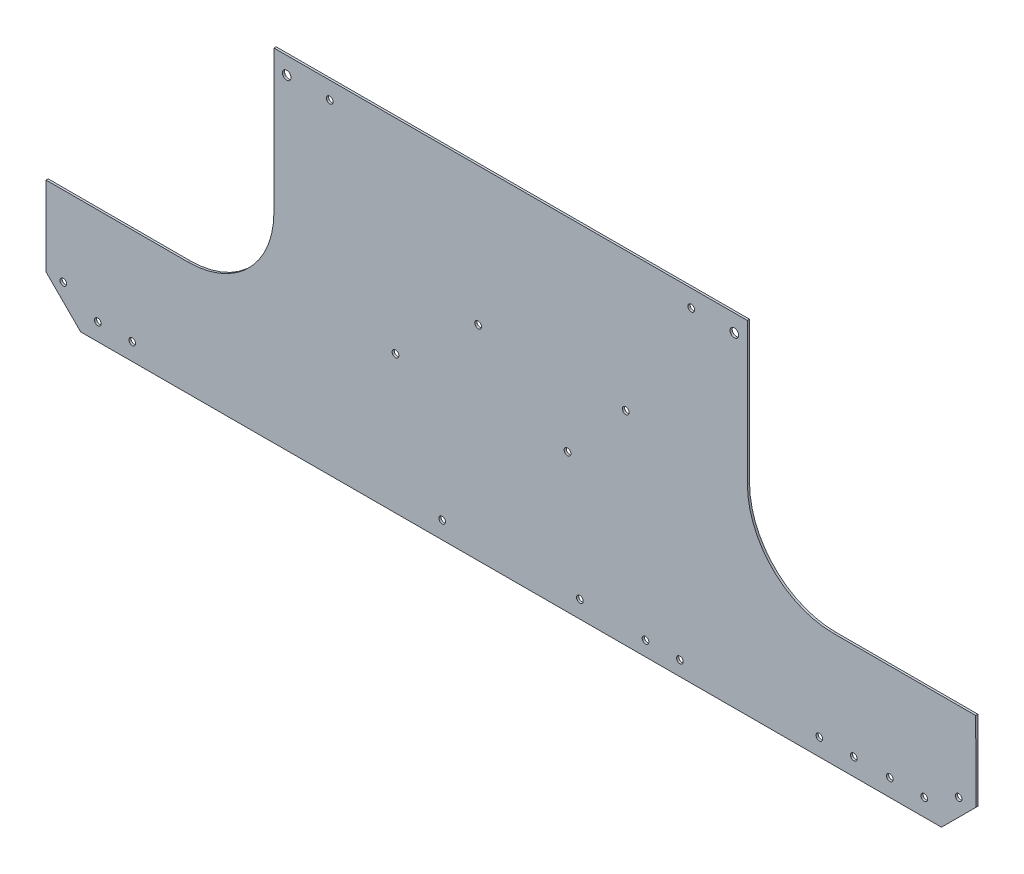
ISO-10303-21;
HEADER;
FILE_DESCRIPTION(('STEP AP214'),'2;1');
FILE_NAME('part.step','',(''),(''),'','','');
FILE_SCHEMA(('AUTOMOTIVE_DESIGN { 1 0 10303 214 1 1 1 1 }'));
ENDSEC;
DATA;
#1=APPLICATION_CONTEXT('core data for automotive mechanical design processes');
#2=APPLICATION_PROTOCOL_DEFINITION('international standard','automotive_design',2000,#1);
#3=PRODUCT_CONTEXT('',#1,'mechanical');
#4=PRODUCT('Part','Part','',(#3));
#5=PRODUCT_RELATED_PRODUCT_CATEGORY('part','',(#4));
#6=PRODUCT_DEFINITION_FORMATION('','',#4);
#7=PRODUCT_DEFINITION_CONTEXT('part definition',#1,'design');
#8=PRODUCT_DEFINITION('design','',#6,#7);
#9=PRODUCT_DEFINITION_SHAPE('','',#8);
#10=(LENGTH_UNIT() NAMED_UNIT(*) SI_UNIT(.MILLI.,.METRE.));
#11=(NAMED_UNIT(*) PLANE_ANGLE_UNIT() SI_UNIT($,.RADIAN.));
#12=(NAMED_UNIT(*) SI_UNIT($,.STERADIAN.) SOLID_ANGLE_UNIT());
#13=UNCERTAINTY_MEASURE_WITH_UNIT(LENGTH_MEASURE(1.E-05),#10,'distance_accuracy_value','');
#14=(GEOMETRIC_REPRESENTATION_CONTEXT(3) GLOBAL_UNCERTAINTY_ASSIGNED_CONTEXT((#13)) GLOBAL_UNIT_ASSIGNED_CONTEXT((#10,
#11,#12)) REPRESENTATION_CONTEXT('',''));
#15=CARTESIAN_POINT('',(0.,0.,0.));
#16=DIRECTION('',(0.,0.,1.));
#17=DIRECTION('',(1.,0.,0.));
#18=AXIS2_PLACEMENT_3D('',#15,#16,#17);
#19=CARTESIAN_POINT('',(0.,0.,0.79375));
#20=DIRECTION('',(0.,0.,1.));
#21=DIRECTION('',(1.,0.,0.));
#22=AXIS2_PLACEMENT_3D('',#19,#20,#21);
#23=PLANE('',#22);
#24=CARTESIAN_POINT('',(19.9172047054702,-149.007237749099,0.793749999999999));
#25=DIRECTION('',(0.,0.,-1.));
#26=DIRECTION('',(-1.,0.,0.));
#27=AXIS2_PLACEMENT_3D('',#24,#25,#26);
#28=CIRCLE('',#27,2.48919999999999);
#29=CARTESIAN_POINT('',(17.4280047054702,-149.007237749099,0.793749999999999));
#30=VERTEX_POINT('',#29);
#31=EDGE_CURVE('E734',#30,#30,#28,.T.);
#32=ORIENTED_EDGE('',*,*,#31,.T.);
#33=EDGE_LOOP('',(#32));
#34=FACE_BOUND('',#33,.T.);
#35=CARTESIAN_POINT('',(-46.0271854160732,-100.817324835213,0.793749999999999));
#36=DIRECTION('',(0.,0.,-1.));
#37=DIRECTION('',(-1.,0.,0.));
#38=AXIS2_PLACEMENT_3D('',#35,#36,#37);
#39=CIRCLE('',#38,2.4892);
#40=CARTESIAN_POINT('',(-48.5163854160732,-100.817324835213,0.793749999999999));
#41=VERTEX_POINT('',#40);
#42=EDGE_CURVE('E739',#41,#41,#39,.T.);
#43=ORIENTED_EDGE('',*,*,#42,.T.);
#44=EDGE_LOOP('',(#43));
#45=FACE_BOUND('',#44,.T.);
#46=CARTESIAN_POINT('',(111.223655321268,-11.4749169265356,0.793750000000001));
#47=DIRECTION('',(0.,0.,1.));
#48=DIRECTION('',(1.,0.,0.));
#49=AXIS2_PLACEMENT_3D('',#46,#47,#48);
#50=CIRCLE('',#49,2.45744999999999);
#51=CARTESIAN_POINT('',(113.681105321268,-11.4749169265356,0.793750000000001));
#52=VERTEX_POINT('',#51);
#53=EDGE_CURVE('E246',#52,#52,#50,.T.);
#54=ORIENTED_EDGE('',*,*,#53,.F.);
#55=EDGE_LOOP('',(#54));
#56=FACE_BOUND('',#55,.T.);
#57=CARTESIAN_POINT('',(-155.475985843315,-11.9127224193871,0.793750000000001));
#58=DIRECTION('',(0.,0.,1.));
#59=DIRECTION('',(1.,0.,0.));
#60=AXIS2_PLACEMENT_3D('',#57,#58,#59);
#61=CIRCLE('',#60,2.45745);
#62=CARTESIAN_POINT('',(-153.018535843315,-11.9127224193871,0.793750000000001));
#63=VERTEX_POINT('',#62);
#64=EDGE_CURVE('E240',#63,#63,#61,.T.);
#65=ORIENTED_EDGE('',*,*,#64,.F.);
#66=EDGE_LOOP('',(#65));
#67=FACE_BOUND('',#66,.T.);
#68=CARTESIAN_POINT('',(308.425197087397,-225.463986018174,0.793750000000001));
#69=DIRECTION('',(0.,0.,1.));
#70=DIRECTION('',(1.,0.,0.));
#71=AXIS2_PLACEMENT_3D('',#68,#69,#70);
#72=CIRCLE('',#71,2.45744999999997);
#73=CARTESIAN_POINT('',(310.882647087397,-225.463986018174,0.793750000000001));
#74=VERTEX_POINT('',#73);
#75=EDGE_CURVE('E234',#74,#74,#72,.T.);
#76=ORIENTED_EDGE('',*,*,#75,.F.);
#77=EDGE_LOOP('',(#76));
#78=FACE_BOUND('',#77,.T.);
#79=CARTESIAN_POINT('',(283.046079192675,-238.205664670761,0.793750000000001));
#80=DIRECTION('',(0.,0.,1.));
#81=DIRECTION('',(1.,0.,0.));
#82=AXIS2_PLACEMENT_3D('',#79,#80,#81);
#83=CIRCLE('',#82,2.45744999999997);
#84=CARTESIAN_POINT('',(285.503529192675,-238.205664670761,0.793750000000001));
#85=VERTEX_POINT('',#84);
#86=EDGE_CURVE('E228',#85,#85,#83,.T.);
#87=ORIENTED_EDGE('',*,*,#86,.F.);
#88=EDGE_LOOP('',(#87));
#89=FACE_BOUND('',#88,.T.);
#90=CARTESIAN_POINT('',(257.646113415862,-238.247360434943,0.793750000000001));
#91=DIRECTION('',(0.,0.,1.));
#92=DIRECTION('',(1.,0.,0.));
#93=AXIS2_PLACEMENT_3D('',#90,#91,#92);
#94=CIRCLE('',#93,2.45744999999997);
#95=CARTESIAN_POINT('',(260.103563415862,-238.247360434943,0.793750000000001));
#96=VERTEX_POINT('',#95);
#97=EDGE_CURVE('E222',#96,#96,#94,.T.);
#98=ORIENTED_EDGE('',*,*,#97,.F.);
#99=EDGE_LOOP('',(#98));
#100=FACE_BOUND('',#99,.T.);
#101=CARTESIAN_POINT('',(231.103150193576,-238.290932508365,0.793750000000001));
#102=DIRECTION('',(0.,0.,1.));
#103=DIRECTION('',(1.,0.,0.));
#104=AXIS2_PLACEMENT_3D('',#101,#102,#103);
#105=CIRCLE('',#104,2.45745);
#106=CARTESIAN_POINT('',(233.560600193576,-238.290932508365,0.793750000000001));
#107=VERTEX_POINT('',#106);
#108=EDGE_CURVE('E216',#107,#107,#105,.T.);
#109=ORIENTED_EDGE('',*,*,#108,.F.);
#110=EDGE_LOOP('',(#109));
#111=FACE_BOUND('',#110,.T.);
#112=CARTESIAN_POINT('',(205.703184416763,-238.332628272546,0.793750000000001));
#113=DIRECTION('',(0.,0.,1.));
#114=DIRECTION('',(1.,0.,0.));
#115=AXIS2_PLACEMENT_3D('',#112,#113,#114);
#116=CIRCLE('',#115,2.45745);
#117=CARTESIAN_POINT('',(208.160634416763,-238.332628272546,0.793750000000001));
#118=VERTEX_POINT('',#117);
#119=EDGE_CURVE('E210',#118,#118,#116,.T.);
#120=ORIENTED_EDGE('',*,*,#119,.F.);
#121=EDGE_LOOP('',(#120));
#122=FACE_BOUND('',#121,.T.);
#123=CARTESIAN_POINT('',(102.836513246974,-240.444898294362,0.793750000000001));
#124=DIRECTION('',(0.,0.,1.));
#125=DIRECTION('',(1.,0.,0.));
#126=AXIS2_PLACEMENT_3D('',#123,#124,#125);
#127=CIRCLE('',#126,2.45744999999999);
#128=CARTESIAN_POINT('',(105.293963246974,-240.444898294362,0.793750000000001));
#129=VERTEX_POINT('',#128);
#130=EDGE_CURVE('E204',#129,#129,#127,.T.);
#131=ORIENTED_EDGE('',*,*,#130,.F.);
#132=EDGE_LOOP('',(#131));
#133=FACE_BOUND('',#132,.T.);
#134=CARTESIAN_POINT('',(77.4365474701611,-240.486594058543,0.793750000000001));
#135=DIRECTION('',(0.,0.,1.));
#136=DIRECTION('',(1.,0.,0.));
#137=AXIS2_PLACEMENT_3D('',#134,#135,#136);
#138=CIRCLE('',#137,2.45744999999999);
#139=CARTESIAN_POINT('',(79.8939974701611,-240.486594058543,0.793750000000001));
#140=VERTEX_POINT('',#139);
#141=EDGE_CURVE('E198',#140,#140,#138,.T.);
#142=ORIENTED_EDGE('',*,*,#141,.F.);
#143=EDGE_LOOP('',(#142));
#144=FACE_BOUND('',#143,.T.);
#145=CARTESIAN_POINT('',(29.0464219324994,-238.622622281374,0.793750000000001));
#146=DIRECTION('',(0.,0.,1.));
#147=DIRECTION('',(1.,0.,0.));
#148=AXIS2_PLACEMENT_3D('',#145,#146,#147);
#149=CIRCLE('',#148,2.45744999999999);
#150=CARTESIAN_POINT('',(31.5038719324994,-238.622622281374,0.793750000000001));
#151=VERTEX_POINT('',#150);
#152=EDGE_CURVE('E192',#151,#151,#149,.T.);
#153=ORIENTED_EDGE('',*,*,#152,.F.);
#154=EDGE_LOOP('',(#153));
#155=FACE_BOUND('',#154,.T.);
#156=CARTESIAN_POINT('',(-72.5534411747708,-238.789405325952,0.793750000000001));
#157=DIRECTION('',(0.,0.,1.));
#158=DIRECTION('',(1.,0.,0.));
#159=AXIS2_PLACEMENT_3D('',#156,#157,#158);
#160=CIRCLE('',#159,2.45744999999999);
#161=CARTESIAN_POINT('',(-70.0959911747708,-238.789405325952,0.793750000000001));
#162=VERTEX_POINT('',#161);
#163=EDGE_CURVE('E186',#162,#162,#160,.T.);
#164=ORIENTED_EDGE('',*,*,#163,.F.);
#165=EDGE_LOOP('',(#164));
#166=FACE_BOUND('',#165,.T.);
#167=CARTESIAN_POINT('',(-351.973913109845,-226.548075817043,0.793750000000001));
#168=DIRECTION('',(0.,0.,1.));
#169=DIRECTION('',(1.,0.,0.));
#170=AXIS2_PLACEMENT_3D('',#167,#168,#169);
#171=CIRCLE('',#170,2.45744999999997);
#172=CARTESIAN_POINT('',(-349.516463109845,-226.548075817043,0.793750000000001));
#173=VERTEX_POINT('',#172);
#174=EDGE_CURVE('E180',#173,#173,#171,.T.);
#175=ORIENTED_EDGE('',*,*,#174,.F.);
#176=EDGE_LOOP('',(#175));
#177=FACE_BOUND('',#176,.T.);
#178=CARTESIAN_POINT('',(-326.553099450941,-239.206362941268,0.793750000000001));
#179=DIRECTION('',(0.,0.,1.));
#180=DIRECTION('',(1.,0.,0.));
#181=AXIS2_PLACEMENT_3D('',#178,#179,#180);
#182=CIRCLE('',#181,2.45744999999997);
#183=CARTESIAN_POINT('',(-324.095649450941,-239.206362941268,0.793750000000001));
#184=VERTEX_POINT('',#183);
#185=EDGE_CURVE('E174',#184,#184,#182,.T.);
#186=ORIENTED_EDGE('',*,*,#185,.F.);
#187=EDGE_LOOP('',(#186));
#188=FACE_BOUND('',#187,.T.);
#189=CARTESIAN_POINT('',(-301.153133674129,-239.164667177087,0.793750000000001));
#190=DIRECTION('',(0.,0.,1.));
#191=DIRECTION('',(1.,0.,0.));
#192=AXIS2_PLACEMENT_3D('',#189,#190,#191);
#193=CIRCLE('',#192,2.45744999999997);
#194=CARTESIAN_POINT('',(-298.695683674129,-239.164667177087,0.793750000000001));
#195=VERTEX_POINT('',#194);
#196=EDGE_CURVE('E168',#195,#195,#193,.T.);
#197=ORIENTED_EDGE('',*,*,#196,.F.);
#198=EDGE_LOOP('',(#197));
#199=FACE_BOUND('',#198,.T.);
#200=DIRECTION('',(0.,1.,0.));
#201=VECTOR('',#200,1.);
#202=CARTESIAN_POINT('',(-196.636236425769,0.,0.79375));
#203=LINE('',#202,#201);
#204=CARTESIAN_POINT('',(-196.636236425769,-104.09186776461,0.79375));
#205=VERTEX_POINT('',#204);
#206=CARTESIAN_POINT('',(-196.636236425769,0.719727301852818,0.79375));
#207=VERTEX_POINT('',#206);
#208=EDGE_CURVE('E12',#205,#207,#203,.T.);
#209=ORIENTED_EDGE('',*,*,#208,.F.);
#210=CARTESIAN_POINT('',(-260.136150867801,-104.196107175063,0.79375));
#211=DIRECTION('',(0.,0.,1.));
#212=DIRECTION('',(1.,0.,0.));
#213=AXIS2_PLACEMENT_3D('',#210,#211,#212);
#214=CIRCLE('',#213,63.5000000000002);
#215=CARTESIAN_POINT('',(-260.031911457348,-167.696021617095,0.79375));
#216=VERTEX_POINT('',#215);
#217=EDGE_CURVE('E45',#216,#205,#214,.T.);
#218=ORIENTED_EDGE('',*,*,#217,.F.);
#219=DIRECTION('',(1.,0.,0.));
#220=VECTOR('',#219,1.);
#221=CARTESIAN_POINT('',(-1.27188827621698E-12,-167.696021617097,0.79375));
#222=LINE('',#221,#220);
#223=CARTESIAN_POINT('',(-364.770538840044,-167.696021617094,0.79375));
#224=VERTEX_POINT('',#223);
#225=EDGE_CURVE('E128',#224,#216,#222,.T.);
#226=ORIENTED_EDGE('',*,*,#225,.F.);
#227=DIRECTION('',(0.00164156551894054,-0.999998652630416,0.));
#228=VECTOR('',#227,1.);
#229=CARTESIAN_POINT('',(-364.674032101712,-226.48539504662,0.79375));
#230=LINE('',#229,#228);
#231=CARTESIAN_POINT('',(-364.674032101712,-226.48539504662,0.79375));
#232=VERTEX_POINT('',#231);
#233=EDGE_CURVE('E264',#224,#232,#230,.T.);
#234=ORIENTED_EDGE('',*,*,#233,.T.);
#235=DIRECTION('',(0.707106781186603,-0.707106781186492,0.));
#236=VECTOR('',#235,1.);
#237=CARTESIAN_POINT('',(-339.232233442783,-251.927193705545,0.79375));
#238=LINE('',#237,#236);
#239=CARTESIAN_POINT('',(-339.232233442783,-251.927193705545,0.79375));
#240=VERTEX_POINT('',#239);
#241=EDGE_CURVE('E266',#232,#240,#238,.T.);
#242=ORIENTED_EDGE('',*,*,#241,.T.);
#243=DIRECTION('',(0.999998652630612,0.00164156539939073,0.));
#244=VECTOR('',#243,1.);
#245=CARTESIAN_POINT('',(-339.232233442783,-251.927193705545,0.79375));
#246=LINE('',#245,#244);
#247=CARTESIAN_POINT('',(295.766909961657,-250.884799678599,0.79375));
#248=VERTEX_POINT('',#247);
#249=EDGE_CURVE('E252',#240,#248,#246,.T.);
#250=ORIENTED_EDGE('',*,*,#249,.T.);
#251=DIRECTION('',(0.707106781186492,0.707106781186603,0.));
#252=VECTOR('',#251,1.);
#253=CARTESIAN_POINT('',(295.766909961657,-250.884799678599,0.79375));
#254=LINE('',#253,#252);
#255=CARTESIAN_POINT('',(321.125317657114,-225.526391983138,0.79375));
#256=VERTEX_POINT('',#255);
#257=EDGE_CURVE('E255',#248,#256,#254,.T.);
#258=ORIENTED_EDGE('',*,*,#257,.T.);
#259=DIRECTION('',(-0.00164156551894076,0.999998652630416,0.));
#260=VECTOR('',#259,1.);
#261=CARTESIAN_POINT('',(321.125317657114,-225.526391983138,0.79375));
#262=LINE('',#261,#260);
#263=CARTESIAN_POINT('',(321.028982035634,-166.84125845138,0.79375));
#264=VERTEX_POINT('',#263);
#265=EDGE_CURVE('E258',#256,#264,#262,.T.);
#266=ORIENTED_EDGE('',*,*,#265,.T.);
#267=DIRECTION('',(1.,0.,0.));
#268=VECTOR('',#267,1.);
#269=CARTESIAN_POINT('',(1.23937766439178E-12,-166.841258451383,0.79375));
#270=LINE('',#269,#268);
#271=CARTESIAN_POINT('',(216.217386967309,-166.841258451381,0.79375));
#272=VERTEX_POINT('',#271);
#273=EDGE_CURVE('E293',#272,#264,#270,.T.);
#274=ORIENTED_EDGE('',*,*,#273,.F.);
#275=CARTESIAN_POINT('',(216.113147556857,-103.34134400935,0.79375));
#276=DIRECTION('',(0.,0.,1.));
#277=DIRECTION('',(1.,0.,0.));
#278=AXIS2_PLACEMENT_3D('',#275,#276,#277);
#279=CIRCLE('',#278,63.4999999999999);
#280=CARTESIAN_POINT('',(152.613233114825,-103.23710459893,0.79375));
#281=VERTEX_POINT('',#280);
#282=EDGE_CURVE('E295',#281,#272,#279,.T.);
#283=ORIENTED_EDGE('',*,*,#282,.F.);
#284=DIRECTION('',(0.,-1.,0.));
#285=VECTOR('',#284,1.);
#286=CARTESIAN_POINT('',(152.613233114825,0.,0.79375));
#287=LINE('',#286,#285);
#288=CARTESIAN_POINT('',(152.613233114825,1.29304395716092,0.79375));
#289=VERTEX_POINT('',#288);
#290=EDGE_CURVE('E297',#289,#281,#287,.T.);
#291=ORIENTED_EDGE('',*,*,#290,.F.);
#292=DIRECTION('',(-0.999998652630434,-0.001641565507867,0.));
#293=VECTOR('',#292,1.);
#294=CARTESIAN_POINT('',(-362.506554298323,0.447439942382596,0.79375));
#295=LINE('',#294,#293);
#296=EDGE_CURVE('E261',#289,#207,#295,.T.);
#297=ORIENTED_EDGE('',*,*,#296,.T.);
#298=EDGE_LOOP('',(#209,#218,#226,#234,#242,#250,#258,#266,#274,#283,#291,#297));
#299=FACE_BOUND('',#298,.T.);
#300=CARTESIAN_POINT('',(-187.225942556252,-11.9648421731485,0.793749999999999));
#301=DIRECTION('',(0.,0.,-1.));
#302=DIRECTION('',(-1.,0.,0.));
#303=AXIS2_PLACEMENT_3D('',#300,#301,#302);
#304=CIRCLE('',#303,3.17499999999998);
#305=CARTESIAN_POINT('',(-190.400942556252,-11.9648421731485,0.793749999999999));
#306=VERTEX_POINT('',#305);
#307=EDGE_CURVE('E141',#306,#306,#304,.T.);
#308=ORIENTED_EDGE('',*,*,#307,.T.);
#309=EDGE_LOOP('',(#308));
#310=FACE_BOUND('',#309,.T.);
#311=CARTESIAN_POINT('',(142.973612542311,-11.4227972387938,0.793749999999999));
#312=DIRECTION('',(0.,0.,-1.));
#313=DIRECTION('',(-1.,0.,0.));
#314=AXIS2_PLACEMENT_3D('',#311,#312,#313);
#315=CIRCLE('',#314,3.17499999999998);
#316=CARTESIAN_POINT('',(139.798612542311,-11.4227972387938,0.793749999999999));
#317=VERTEX_POINT('',#316);
#318=EDGE_CURVE('E751',#317,#317,#315,.T.);
#319=ORIENTED_EDGE('',*,*,#318,.T.);
#320=EDGE_LOOP('',(#319));
#321=FACE_BOUND('',#320,.T.);
#322=CARTESIAN_POINT('',(-106.973826126863,-149.761638685178,0.793749999999999));
#323=DIRECTION('',(0.,0.,-1.));
#324=DIRECTION('',(-1.,0.,0.));
#325=AXIS2_PLACEMENT_3D('',#322,#323,#324);
#326=CIRCLE('',#325,2.4892);
#327=CARTESIAN_POINT('',(-109.463026126863,-149.761638685178,0.793749999999999));
#328=VERTEX_POINT('',#327);
#329=EDGE_CURVE('E745',#328,#328,#326,.T.);
#330=ORIENTED_EDGE('',*,*,#329,.T.);
#331=EDGE_LOOP('',(#330));
#332=FACE_BOUND('',#331,.T.);
#333=CARTESIAN_POINT('',(62.8852053522805,-101.18699199641,0.793749999999999));
#334=DIRECTION('',(0.,0.,-1.));
#335=DIRECTION('',(-1.,0.,0.));
#336=AXIS2_PLACEMENT_3D('',#333,#334,#335);
#337=CIRCLE('',#336,2.4892);
#338=CARTESIAN_POINT('',(60.3960053522805,-101.18699199641,0.793749999999999));
#339=VERTEX_POINT('',#338);
#340=EDGE_CURVE('E724',#339,#339,#337,.T.);
#341=ORIENTED_EDGE('',*,*,#340,.T.);
#342=EDGE_LOOP('',(#341));
#343=FACE_BOUND('',#342,.T.);
#344=ADVANCED_FACE('F37',(#34,#45,#56,#67,#78,#89,#100,#111,#122,#133,#144,#155,#166,#177,#188,
#199,#299,#310,#321,#332,#343),#23,.T.);
#345=CARTESIAN_POINT('',(0.,0.,-0.79375));
#346=DIRECTION('',(0.,0.,1.));
#347=DIRECTION('',(1.,0.,0.));
#348=AXIS2_PLACEMENT_3D('',#345,#346,#347);
#349=PLANE('',#348);
#350=CARTESIAN_POINT('',(62.8852053522805,-101.18699199641,-0.79375));
#351=DIRECTION('',(0.,0.,-1.));
#352=DIRECTION('',(-1.,0.,0.));
#353=AXIS2_PLACEMENT_3D('',#350,#351,#352);
#354=CIRCLE('',#353,2.4892);
#355=CARTESIAN_POINT('',(60.3960053522805,-101.18699199641,-0.79375));
#356=VERTEX_POINT('',#355);
#357=EDGE_CURVE('E727',#356,#356,#354,.T.);
#358=ORIENTED_EDGE('',*,*,#357,.F.);
#359=EDGE_LOOP('',(#358));
#360=FACE_BOUND('',#359,.T.);
#361=CARTESIAN_POINT('',(19.9172047054702,-149.007237749099,-0.79375));
#362=DIRECTION('',(0.,0.,-1.));
#363=DIRECTION('',(-1.,0.,0.));
#364=AXIS2_PLACEMENT_3D('',#361,#362,#363);
#365=CIRCLE('',#364,2.4892);
#366=CARTESIAN_POINT('',(17.4280047054702,-149.007237749099,-0.79375));
#367=VERTEX_POINT('',#366);
#368=EDGE_CURVE('E729',#367,#367,#365,.T.);
#369=ORIENTED_EDGE('',*,*,#368,.F.);
#370=EDGE_LOOP('',(#369));
#371=FACE_BOUND('',#370,.T.);
#372=CARTESIAN_POINT('',(-46.0271854160732,-100.817324835213,-0.79375));
#373=DIRECTION('',(0.,0.,-1.));
#374=DIRECTION('',(-1.,0.,0.));
#375=AXIS2_PLACEMENT_3D('',#372,#373,#374);
#376=CIRCLE('',#375,2.4892);
#377=CARTESIAN_POINT('',(-48.5163854160732,-100.817324835213,-0.79375));
#378=VERTEX_POINT('',#377);
#379=EDGE_CURVE('E736',#378,#378,#376,.T.);
#380=ORIENTED_EDGE('',*,*,#379,.F.);
#381=EDGE_LOOP('',(#380));
#382=FACE_BOUND('',#381,.T.);
#383=CARTESIAN_POINT('',(-106.973826126863,-149.761638685178,-0.79375));
#384=DIRECTION('',(0.,0.,-1.));
#385=DIRECTION('',(-1.,0.,0.));
#386=AXIS2_PLACEMENT_3D('',#383,#384,#385);
#387=CIRCLE('',#386,2.4892);
#388=CARTESIAN_POINT('',(-109.463026126863,-149.761638685178,-0.79375));
#389=VERTEX_POINT('',#388);
#390=EDGE_CURVE('E742',#389,#389,#387,.T.);
#391=ORIENTED_EDGE('',*,*,#390,.F.);
#392=EDGE_LOOP('',(#391));
#393=FACE_BOUND('',#392,.T.);
#394=CARTESIAN_POINT('',(142.973612542311,-11.4227972387938,-0.79375));
#395=DIRECTION('',(0.,0.,-1.));
#396=DIRECTION('',(-1.,0.,0.));
#397=AXIS2_PLACEMENT_3D('',#394,#395,#396);
#398=CIRCLE('',#397,3.17499999999998);
#399=CARTESIAN_POINT('',(139.798612542311,-11.4227972387938,-0.79375));
#400=VERTEX_POINT('',#399);
#401=EDGE_CURVE('E748',#400,#400,#398,.T.);
#402=ORIENTED_EDGE('',*,*,#401,.F.);
#403=EDGE_LOOP('',(#402));
#404=FACE_BOUND('',#403,.T.);
#405=CARTESIAN_POINT('',(-187.225942556252,-11.9648421731485,-0.79375));
#406=DIRECTION('',(0.,0.,-1.));
#407=DIRECTION('',(-1.,0.,0.));
#408=AXIS2_PLACEMENT_3D('',#405,#406,#407);
#409=CIRCLE('',#408,3.17499999999998);
#410=CARTESIAN_POINT('',(-190.400942556252,-11.9648421731485,-0.79375));
#411=VERTEX_POINT('',#410);
#412=EDGE_CURVE('E754',#411,#411,#409,.T.);
#413=ORIENTED_EDGE('',*,*,#412,.F.);
#414=EDGE_LOOP('',(#413));
#415=FACE_BOUND('',#414,.T.);
#416=CARTESIAN_POINT('',(-301.153133674129,-239.164667177087,-0.79375));
#417=DIRECTION('',(0.,0.,1.));
#418=DIRECTION('',(1.,0.,0.));
#419=AXIS2_PLACEMENT_3D('',#416,#417,#418);
#420=CIRCLE('',#419,2.45744999999997);
#421=CARTESIAN_POINT('',(-298.695683674129,-239.164667177087,-0.79375));
#422=VERTEX_POINT('',#421);
#423=EDGE_CURVE('E171',#422,#422,#420,.T.);
#424=ORIENTED_EDGE('',*,*,#423,.T.);
#425=EDGE_LOOP('',(#424));
#426=FACE_BOUND('',#425,.T.);
#427=CARTESIAN_POINT('',(-326.553099450941,-239.206362941268,-0.79375));
#428=DIRECTION('',(0.,0.,1.));
#429=DIRECTION('',(1.,0.,0.));
#430=AXIS2_PLACEMENT_3D('',#427,#428,#429);
#431=CIRCLE('',#430,2.45744999999997);
#432=CARTESIAN_POINT('',(-324.095649450941,-239.206362941268,-0.79375));
#433=VERTEX_POINT('',#432);
#434=EDGE_CURVE('E177',#433,#433,#431,.T.);
#435=ORIENTED_EDGE('',*,*,#434,.T.);
#436=EDGE_LOOP('',(#435));
#437=FACE_BOUND('',#436,.T.);
#438=CARTESIAN_POINT('',(-351.973913109845,-226.548075817043,-0.79375));
#439=DIRECTION('',(0.,0.,1.));
#440=DIRECTION('',(1.,0.,0.));
#441=AXIS2_PLACEMENT_3D('',#438,#439,#440);
#442=CIRCLE('',#441,2.45744999999997);
#443=CARTESIAN_POINT('',(-349.516463109845,-226.548075817043,-0.79375));
#444=VERTEX_POINT('',#443);
#445=EDGE_CURVE('E183',#444,#444,#442,.T.);
#446=ORIENTED_EDGE('',*,*,#445,.T.);
#447=EDGE_LOOP('',(#446));
#448=FACE_BOUND('',#447,.T.);
#449=CARTESIAN_POINT('',(-72.5534411747708,-238.789405325952,-0.79375));
#450=DIRECTION('',(0.,0.,1.));
#451=DIRECTION('',(1.,0.,0.));
#452=AXIS2_PLACEMENT_3D('',#449,#450,#451);
#453=CIRCLE('',#452,2.45745);
#454=CARTESIAN_POINT('',(-70.0959911747708,-238.789405325952,-0.79375));
#455=VERTEX_POINT('',#454);
#456=EDGE_CURVE('E189',#455,#455,#453,.T.);
#457=ORIENTED_EDGE('',*,*,#456,.T.);
#458=EDGE_LOOP('',(#457));
#459=FACE_BOUND('',#458,.T.);
#460=CARTESIAN_POINT('',(29.0464219324994,-238.622622281374,-0.79375));
#461=DIRECTION('',(0.,0.,1.));
#462=DIRECTION('',(1.,0.,0.));
#463=AXIS2_PLACEMENT_3D('',#460,#461,#462);
#464=CIRCLE('',#463,2.45745);
#465=CARTESIAN_POINT('',(31.5038719324994,-238.622622281374,-0.79375));
#466=VERTEX_POINT('',#465);
#467=EDGE_CURVE('E195',#466,#466,#464,.T.);
#468=ORIENTED_EDGE('',*,*,#467,.T.);
#469=EDGE_LOOP('',(#468));
#470=FACE_BOUND('',#469,.T.);
#471=CARTESIAN_POINT('',(77.4365474701611,-240.486594058543,-0.79375));
#472=DIRECTION('',(0.,0.,1.));
#473=DIRECTION('',(1.,0.,0.));
#474=AXIS2_PLACEMENT_3D('',#471,#472,#473);
#475=CIRCLE('',#474,2.45745);
#476=CARTESIAN_POINT('',(79.8939974701611,-240.486594058543,-0.79375));
#477=VERTEX_POINT('',#476);
#478=EDGE_CURVE('E201',#477,#477,#475,.T.);
#479=ORIENTED_EDGE('',*,*,#478,.T.);
#480=EDGE_LOOP('',(#479));
#481=FACE_BOUND('',#480,.T.);
#482=CARTESIAN_POINT('',(102.836513246974,-240.444898294362,-0.79375));
#483=DIRECTION('',(0.,0.,1.));
#484=DIRECTION('',(1.,0.,0.));
#485=AXIS2_PLACEMENT_3D('',#482,#483,#484);
#486=CIRCLE('',#485,2.45745);
#487=CARTESIAN_POINT('',(105.293963246974,-240.444898294362,-0.79375));
#488=VERTEX_POINT('',#487);
#489=EDGE_CURVE('E207',#488,#488,#486,.T.);
#490=ORIENTED_EDGE('',*,*,#489,.T.);
#491=EDGE_LOOP('',(#490));
#492=FACE_BOUND('',#491,.T.);
#493=CARTESIAN_POINT('',(205.703184416763,-238.332628272546,-0.79375));
#494=DIRECTION('',(0.,0.,1.));
#495=DIRECTION('',(1.,0.,0.));
#496=AXIS2_PLACEMENT_3D('',#493,#494,#495);
#497=CIRCLE('',#496,2.45745);
#498=CARTESIAN_POINT('',(208.160634416763,-238.332628272546,-0.79375));
#499=VERTEX_POINT('',#498);
#500=EDGE_CURVE('E213',#499,#499,#497,.T.);
#501=ORIENTED_EDGE('',*,*,#500,.T.);
#502=EDGE_LOOP('',(#501));
#503=FACE_BOUND('',#502,.T.);
#504=CARTESIAN_POINT('',(231.103150193576,-238.290932508365,-0.79375));
#505=DIRECTION('',(0.,0.,1.));
#506=DIRECTION('',(1.,0.,0.));
#507=AXIS2_PLACEMENT_3D('',#504,#505,#506);
#508=CIRCLE('',#507,2.45745);
#509=CARTESIAN_POINT('',(233.560600193576,-238.290932508365,-0.79375));
#510=VERTEX_POINT('',#509);
#511=EDGE_CURVE('E219',#510,#510,#508,.T.);
#512=ORIENTED_EDGE('',*,*,#511,.T.);
#513=EDGE_LOOP('',(#512));
#514=FACE_BOUND('',#513,.T.);
#515=CARTESIAN_POINT('',(257.646113415862,-238.247360434943,-0.79375));
#516=DIRECTION('',(0.,0.,1.));
#517=DIRECTION('',(1.,0.,0.));
#518=AXIS2_PLACEMENT_3D('',#515,#516,#517);
#519=CIRCLE('',#518,2.45744999999997);
#520=CARTESIAN_POINT('',(260.103563415862,-238.247360434943,-0.79375));
#521=VERTEX_POINT('',#520);
#522=EDGE_CURVE('E225',#521,#521,#519,.T.);
#523=ORIENTED_EDGE('',*,*,#522,.T.);
#524=EDGE_LOOP('',(#523));
#525=FACE_BOUND('',#524,.T.);
#526=CARTESIAN_POINT('',(283.046079192675,-238.205664670761,-0.79375));
#527=DIRECTION('',(0.,0.,1.));
#528=DIRECTION('',(1.,0.,0.));
#529=AXIS2_PLACEMENT_3D('',#526,#527,#528);
#530=CIRCLE('',#529,2.45744999999997);
#531=CARTESIAN_POINT('',(285.503529192675,-238.205664670761,-0.79375));
#532=VERTEX_POINT('',#531);
#533=EDGE_CURVE('E231',#532,#532,#530,.T.);
#534=ORIENTED_EDGE('',*,*,#533,.T.);
#535=EDGE_LOOP('',(#534));
#536=FACE_BOUND('',#535,.T.);
#537=CARTESIAN_POINT('',(308.425197087397,-225.463986018174,-0.79375));
#538=DIRECTION('',(0.,0.,1.));
#539=DIRECTION('',(1.,0.,0.));
#540=AXIS2_PLACEMENT_3D('',#537,#538,#539);
#541=CIRCLE('',#540,2.45744999999997);
#542=CARTESIAN_POINT('',(310.882647087397,-225.463986018174,-0.79375));
#543=VERTEX_POINT('',#542);
#544=EDGE_CURVE('E237',#543,#543,#541,.T.);
#545=ORIENTED_EDGE('',*,*,#544,.T.);
#546=EDGE_LOOP('',(#545));
#547=FACE_BOUND('',#546,.T.);
#548=CARTESIAN_POINT('',(-155.475985843315,-11.9127224193871,-0.79375));
#549=DIRECTION('',(0.,0.,1.));
#550=DIRECTION('',(1.,0.,0.));
#551=AXIS2_PLACEMENT_3D('',#548,#549,#550);
#552=CIRCLE('',#551,2.45745);
#553=CARTESIAN_POINT('',(-153.018535843315,-11.9127224193871,-0.79375));
#554=VERTEX_POINT('',#553);
#555=EDGE_CURVE('E243',#554,#554,#552,.T.);
#556=ORIENTED_EDGE('',*,*,#555,.T.);
#557=EDGE_LOOP('',(#556));
#558=FACE_BOUND('',#557,.T.);
#559=CARTESIAN_POINT('',(111.223655321268,-11.4749169265356,-0.79375));
#560=DIRECTION('',(0.,0.,1.));
#561=DIRECTION('',(1.,0.,0.));
#562=AXIS2_PLACEMENT_3D('',#559,#560,#561);
#563=CIRCLE('',#562,2.45745);
#564=CARTESIAN_POINT('',(113.681105321268,-11.4749169265356,-0.79375));
#565=VERTEX_POINT('',#564);
#566=EDGE_CURVE('E249',#565,#565,#563,.T.);
#567=ORIENTED_EDGE('',*,*,#566,.T.);
#568=EDGE_LOOP('',(#567));
#569=FACE_BOUND('',#568,.T.);
#570=CARTESIAN_POINT('',(-260.136150867801,-104.196107175063,-0.79375));
#571=DIRECTION('',(0.,0.,-1.));
#572=DIRECTION('',(1.,0.,0.));
#573=AXIS2_PLACEMENT_3D('',#570,#571,#572);
#574=CIRCLE('',#573,63.5000000000002);
#575=CARTESIAN_POINT('',(-196.636236425769,-104.09186776461,-0.79375));
#576=VERTEX_POINT('',#575);
#577=CARTESIAN_POINT('',(-260.031911457348,-167.696021617095,-0.79375));
#578=VERTEX_POINT('',#577);
#579=EDGE_CURVE('E135',#576,#578,#574,.T.);
#580=ORIENTED_EDGE('',*,*,#579,.F.);
#581=DIRECTION('',(0.,-1.,0.));
#582=VECTOR('',#581,1.);
#583=CARTESIAN_POINT('',(-196.636236425769,-104.09186776461,-0.79375));
#584=LINE('',#583,#582);
#585=CARTESIAN_POINT('',(-196.636236425769,0.719727301852814,-0.79375));
#586=VERTEX_POINT('',#585);
#587=EDGE_CURVE('E132',#586,#576,#584,.T.);
#588=ORIENTED_EDGE('',*,*,#587,.F.);
#589=DIRECTION('',(-0.999998652630434,-0.001641565507867,0.));
#590=VECTOR('',#589,1.);
#591=CARTESIAN_POINT('',(-0.0017113609259982,1.042516190771,-0.79375));
#592=LINE('',#591,#590);
#593=CARTESIAN_POINT('',(152.613233114825,1.29304395716092,-0.79375));
#594=VERTEX_POINT('',#593);
#595=EDGE_CURVE('E284',#594,#586,#592,.T.);
#596=ORIENTED_EDGE('',*,*,#595,.F.);
#597=DIRECTION('',(0.,1.,0.));
#598=VECTOR('',#597,1.);
#599=CARTESIAN_POINT('',(152.613233114825,-103.23710459893,-0.79375));
#600=LINE('',#599,#598);
#601=CARTESIAN_POINT('',(152.613233114825,-103.23710459893,-0.79375));
#602=VERTEX_POINT('',#601);
#603=EDGE_CURVE('E159',#602,#594,#600,.T.);
#604=ORIENTED_EDGE('',*,*,#603,.F.);
#605=CARTESIAN_POINT('',(216.113147556857,-103.34134400935,-0.79375));
#606=DIRECTION('',(0.,0.,-1.));
#607=DIRECTION('',(1.,0.,0.));
#608=AXIS2_PLACEMENT_3D('',#605,#606,#607);
#609=CIRCLE('',#608,63.4999999999999);
#610=CARTESIAN_POINT('',(216.217386967309,-166.841258451381,-0.79375));
#611=VERTEX_POINT('',#610);
#612=EDGE_CURVE('E156',#611,#602,#609,.T.);
#613=ORIENTED_EDGE('',*,*,#612,.F.);
#614=DIRECTION('',(-1.,0.,0.));
#615=VECTOR('',#614,1.);
#616=CARTESIAN_POINT('',(216.217386967309,-166.841258451381,-0.79375));
#617=LINE('',#616,#615);
#618=CARTESIAN_POINT('',(321.028982035634,-166.84125845138,-0.79375));
#619=VERTEX_POINT('',#618);
#620=EDGE_CURVE('E154',#619,#611,#617,.T.);
#621=ORIENTED_EDGE('',*,*,#620,.F.);
#622=DIRECTION('',(-0.00164156551894076,0.999998652630416,0.));
#623=VECTOR('',#622,1.);
#624=CARTESIAN_POINT('',(320.754236458853,0.52653980406874,-0.79375));
#625=LINE('',#624,#623);
#626=CARTESIAN_POINT('',(321.125317657114,-225.526391983138,-0.79375));
#627=VERTEX_POINT('',#626);
#628=EDGE_CURVE('E281',#627,#619,#625,.T.);
#629=ORIENTED_EDGE('',*,*,#628,.F.);
#630=DIRECTION('',(0.707106781186492,0.707106781186603,0.));
#631=VECTOR('',#630,1.);
#632=CARTESIAN_POINT('',(273.325854820151,-273.325854820108,-0.79375));
#633=LINE('',#632,#631);
#634=CARTESIAN_POINT('',(295.766909961657,-250.884799678599,-0.79375));
#635=VERTEX_POINT('',#634);
#636=EDGE_CURVE('E272',#635,#627,#633,.T.);
#637=ORIENTED_EDGE('',*,*,#636,.F.);
#638=DIRECTION('',(0.999998652630612,0.00164156539939073,0.));
#639=VECTOR('',#638,1.);
#640=CARTESIAN_POINT('',(0.412640265503685,-251.369643681559,-0.79375));
#641=LINE('',#640,#639);
#642=CARTESIAN_POINT('',(-339.232233442783,-251.927193705545,-0.79375));
#643=VERTEX_POINT('',#642);
#644=EDGE_CURVE('E290',#643,#635,#641,.T.);
#645=ORIENTED_EDGE('',*,*,#644,.F.);
#646=DIRECTION('',(0.707106781186603,-0.707106781186492,0.));
#647=VECTOR('',#646,1.);
#648=CARTESIAN_POINT('',(-295.579713574137,-295.579713574184,-0.79375));
#649=LINE('',#648,#647);
#650=CARTESIAN_POINT('',(-364.674032101712,-226.48539504662,-0.79375));
#651=VERTEX_POINT('',#650);
#652=EDGE_CURVE('E288',#651,#643,#649,.T.);
#653=ORIENTED_EDGE('',*,*,#652,.F.);
#654=DIRECTION('',(0.00164156551894054,-0.999998652630416,0.));
#655=VECTOR('',#654,1.);
#656=CARTESIAN_POINT('',(-365.044839515088,-0.599245828820755,-0.79375));
#657=LINE('',#656,#655);
#658=CARTESIAN_POINT('',(-364.770538840044,-167.696021617094,-0.79375));
#659=VERTEX_POINT('',#658);
#660=EDGE_CURVE('E145',#659,#651,#657,.T.);
#661=ORIENTED_EDGE('',*,*,#660,.F.);
#662=DIRECTION('',(-1.,0.,0.));
#663=VECTOR('',#662,1.);
#664=CARTESIAN_POINT('',(-260.031911457348,-167.696021617095,-0.79375));
#665=LINE('',#664,#663);
#666=EDGE_CURVE('E127',#578,#659,#665,.T.);
#667=ORIENTED_EDGE('',*,*,#666,.F.);
#668=EDGE_LOOP('',(#580,#588,#596,#604,#613,#621,#629,#637,#645,#653,#661,#667));
#669=FACE_BOUND('',#668,.T.);
#670=ADVANCED_FACE('F39',(#360,#371,#382,#393,#404,#415,#426,#437,#448,#459,#470,#481,#492,#503,
#514,#525,#536,#547,#558,#569,#669),#349,.F.);
#671=CARTESIAN_POINT('',(-339.232233442783,-251.927193705545,-1.74625));
#672=DIRECTION('',(0.00164156539939073,-0.999998652630612,0.));
#673=DIRECTION('',(0.999998652630612,0.00164156539939073,0.));
#674=AXIS2_PLACEMENT_3D('',#671,#672,#673);
#675=PLANE('',#674);
#676=ORIENTED_EDGE('',*,*,#644,.T.);
#677=DIRECTION('',(0.,0.,1.));
#678=VECTOR('',#677,1.);
#679=CARTESIAN_POINT('',(295.766909961657,-250.884799678599,-1.74625));
#680=LINE('',#679,#678);
#681=EDGE_CURVE('E269',#635,#248,#680,.T.);
#682=ORIENTED_EDGE('',*,*,#681,.T.);
#683=ORIENTED_EDGE('',*,*,#249,.F.);
#684=DIRECTION('',(0.,0.,1.));
#685=VECTOR('',#684,1.);
#686=CARTESIAN_POINT('',(-339.232233442783,-251.927193705545,-1.74625));
#687=LINE('',#686,#685);
#688=EDGE_CURVE('E270',#643,#240,#687,.T.);
#689=ORIENTED_EDGE('',*,*,#688,.F.);
#690=EDGE_LOOP('',(#676,#682,#683,#689));
#691=FACE_BOUND('',#690,.T.);
#692=ADVANCED_FACE('F335',(#691),#675,.T.);
#693=CARTESIAN_POINT('',(-339.232233442783,-251.927193705545,-1.74625));
#694=DIRECTION('',(-0.707106781186492,-0.707106781186603,0.));
#695=DIRECTION('',(0.707106781186603,-0.707106781186492,0.));
#696=AXIS2_PLACEMENT_3D('',#693,#694,#695);
#697=PLANE('',#696);
#698=ORIENTED_EDGE('',*,*,#652,.T.);
#699=ORIENTED_EDGE('',*,*,#688,.T.);
#700=ORIENTED_EDGE('',*,*,#241,.F.);
#701=DIRECTION('',(0.,0.,1.));
#702=VECTOR('',#701,1.);
#703=CARTESIAN_POINT('',(-364.674032101712,-226.48539504662,-1.74625));
#704=LINE('',#703,#702);
#705=EDGE_CURVE('E273',#651,#232,#704,.T.);
#706=ORIENTED_EDGE('',*,*,#705,.F.);
#707=EDGE_LOOP('',(#698,#699,#700,#706));
#708=FACE_BOUND('',#707,.T.);
#709=ADVANCED_FACE('F339',(#708),#697,.T.);
#710=CARTESIAN_POINT('',(-364.674032101712,-226.48539504662,-1.74625));
#711=DIRECTION('',(-0.999998652630416,-0.00164156551894054,0.));
#712=DIRECTION('',(0.00164156551894054,-0.999998652630416,0.));
#713=AXIS2_PLACEMENT_3D('',#710,#711,#712);
#714=PLANE('',#713);
#715=DIRECTION('',(0.,0.,1.));
#716=VECTOR('',#715,1.);
#717=CARTESIAN_POINT('',(-364.770538840044,-167.696021617094,-1.74625));
#718=LINE('',#717,#716);
#719=EDGE_CURVE('E52',#659,#224,#718,.T.);
#720=ORIENTED_EDGE('',*,*,#719,.F.);
#721=ORIENTED_EDGE('',*,*,#660,.T.);
#722=ORIENTED_EDGE('',*,*,#705,.T.);
#723=ORIENTED_EDGE('',*,*,#233,.F.);
#724=EDGE_LOOP('',(#720,#721,#722,#723));
#725=FACE_BOUND('',#724,.T.);
#726=ADVANCED_FACE('F342',(#725),#714,.T.);
#727=CARTESIAN_POINT('',(-362.506554298323,0.447439942382596,-1.74625));
#728=DIRECTION('',(-0.001641565507867,0.999998652630434,0.));
#729=DIRECTION('',(-0.999998652630434,-0.001641565507867,0.));
#730=AXIS2_PLACEMENT_3D('',#727,#728,#729);
#731=PLANE('',#730);
#732=DIRECTION('',(0.,0.,-1.));
#733=VECTOR('',#732,1.);
#734=CARTESIAN_POINT('',(-196.636236425769,0.719727301852818,-1.74625));
#735=LINE('',#734,#733);
#736=EDGE_CURVE('E152',#207,#586,#735,.T.);
#737=ORIENTED_EDGE('',*,*,#736,.F.);
#738=ORIENTED_EDGE('',*,*,#296,.F.);
#739=DIRECTION('',(0.,0.,1.));
#740=VECTOR('',#739,1.);
#741=CARTESIAN_POINT('',(152.613233114825,1.29304395716092,-1.74625));
#742=LINE('',#741,#740);
#743=EDGE_CURVE('E166',#594,#289,#742,.T.);
#744=ORIENTED_EDGE('',*,*,#743,.F.);
#745=ORIENTED_EDGE('',*,*,#595,.T.);
#746=EDGE_LOOP('',(#737,#738,#744,#745));
#747=FACE_BOUND('',#746,.T.);
#748=ADVANCED_FACE('F310',(#747),#731,.T.);
#749=CARTESIAN_POINT('',(321.125317657114,-225.526391983138,-1.74625));
#750=DIRECTION('',(0.999998652630416,0.00164156551894076,0.));
#751=DIRECTION('',(-0.00164156551894076,0.999998652630416,0.));
#752=AXIS2_PLACEMENT_3D('',#749,#750,#751);
#753=PLANE('',#752);
#754=DIRECTION('',(0.,0.,-1.));
#755=VECTOR('',#754,1.);
#756=CARTESIAN_POINT('',(321.028982035634,-166.84125845138,-1.74625));
#757=LINE('',#756,#755);
#758=EDGE_CURVE('E163',#264,#619,#757,.T.);
#759=ORIENTED_EDGE('',*,*,#758,.F.);
#760=ORIENTED_EDGE('',*,*,#265,.F.);
#761=DIRECTION('',(0.,0.,1.));
#762=VECTOR('',#761,1.);
#763=CARTESIAN_POINT('',(321.125317657114,-225.526391983138,-1.74625));
#764=LINE('',#763,#762);
#765=EDGE_CURVE('E276',#627,#256,#764,.T.);
#766=ORIENTED_EDGE('',*,*,#765,.F.);
#767=ORIENTED_EDGE('',*,*,#628,.T.);
#768=EDGE_LOOP('',(#759,#760,#766,#767));
#769=FACE_BOUND('',#768,.T.);
#770=ADVANCED_FACE('F327',(#769),#753,.T.);
#771=CARTESIAN_POINT('',(295.766909961657,-250.884799678599,-1.74625));
#772=DIRECTION('',(0.707106781186603,-0.707106781186492,0.));
#773=DIRECTION('',(0.707106781186492,0.707106781186603,0.));
#774=AXIS2_PLACEMENT_3D('',#771,#772,#773);
#775=PLANE('',#774);
#776=ORIENTED_EDGE('',*,*,#636,.T.);
#777=ORIENTED_EDGE('',*,*,#765,.T.);
#778=ORIENTED_EDGE('',*,*,#257,.F.);
#779=ORIENTED_EDGE('',*,*,#681,.F.);
#780=EDGE_LOOP('',(#776,#777,#778,#779));
#781=FACE_BOUND('',#780,.T.);
#782=ADVANCED_FACE('F330',(#781),#775,.T.);
#783=CARTESIAN_POINT('',(111.223655321268,-11.4749169265356,0.79375));
#784=DIRECTION('',(0.,0.,1.));
#785=DIRECTION('',(1.,0.,0.));
#786=AXIS2_PLACEMENT_3D('',#783,#784,#785);
#787=CYLINDRICAL_SURFACE('',#786,2.45744999999999);
#788=ORIENTED_EDGE('',*,*,#566,.F.);
#789=EDGE_LOOP('',(#788));
#790=FACE_BOUND('',#789,.T.);
#791=ORIENTED_EDGE('',*,*,#53,.T.);
#792=EDGE_LOOP('',(#791));
#793=FACE_BOUND('',#792,.T.);
#794=ADVANCED_FACE('F365',(#790,#793),#787,.F.);
#795=CARTESIAN_POINT('',(-155.475985843315,-11.9127224193871,0.79375));
#796=DIRECTION('',(0.,0.,1.));
#797=DIRECTION('',(1.,0.,0.));
#798=AXIS2_PLACEMENT_3D('',#795,#796,#797);
#799=CYLINDRICAL_SURFACE('',#798,2.45745);
#800=ORIENTED_EDGE('',*,*,#555,.F.);
#801=EDGE_LOOP('',(#800));
#802=FACE_BOUND('',#801,.T.);
#803=ORIENTED_EDGE('',*,*,#64,.T.);
#804=EDGE_LOOP('',(#803));
#805=FACE_BOUND('',#804,.T.);
#806=ADVANCED_FACE('F384',(#802,#805),#799,.F.);
#807=CARTESIAN_POINT('',(308.425197087397,-225.463986018174,0.79375));
#808=DIRECTION('',(0.,0.,1.));
#809=DIRECTION('',(1.,0.,0.));
#810=AXIS2_PLACEMENT_3D('',#807,#808,#809);
#811=CYLINDRICAL_SURFACE('',#810,2.45744999999997);
#812=ORIENTED_EDGE('',*,*,#544,.F.);
#813=EDGE_LOOP('',(#812));
#814=FACE_BOUND('',#813,.T.);
#815=ORIENTED_EDGE('',*,*,#75,.T.);
#816=EDGE_LOOP('',(#815));
#817=FACE_BOUND('',#816,.T.);
#818=ADVANCED_FACE('F392',(#814,#817),#811,.F.);
#819=CARTESIAN_POINT('',(283.046079192675,-238.205664670761,0.79375));
#820=DIRECTION('',(0.,0.,1.));
#821=DIRECTION('',(1.,0.,0.));
#822=AXIS2_PLACEMENT_3D('',#819,#820,#821);
#823=CYLINDRICAL_SURFACE('',#822,2.45744999999997);
#824=ORIENTED_EDGE('',*,*,#533,.F.);
#825=EDGE_LOOP('',(#824));
#826=FACE_BOUND('',#825,.T.);
#827=ORIENTED_EDGE('',*,*,#86,.T.);
#828=EDGE_LOOP('',(#827));
#829=FACE_BOUND('',#828,.T.);
#830=ADVANCED_FACE('F400',(#826,#829),#823,.F.);
#831=CARTESIAN_POINT('',(257.646113415862,-238.247360434943,0.79375));
#832=DIRECTION('',(0.,0.,1.));
#833=DIRECTION('',(1.,0.,0.));
#834=AXIS2_PLACEMENT_3D('',#831,#832,#833);
#835=CYLINDRICAL_SURFACE('',#834,2.45744999999997);
#836=ORIENTED_EDGE('',*,*,#522,.F.);
#837=EDGE_LOOP('',(#836));
#838=FACE_BOUND('',#837,.T.);
#839=ORIENTED_EDGE('',*,*,#97,.T.);
#840=EDGE_LOOP('',(#839));
#841=FACE_BOUND('',#840,.T.);
#842=ADVANCED_FACE('F408',(#838,#841),#835,.F.);
#843=CARTESIAN_POINT('',(231.103150193576,-238.290932508365,0.79375));
#844=DIRECTION('',(0.,0.,1.));
#845=DIRECTION('',(1.,0.,0.));
#846=AXIS2_PLACEMENT_3D('',#843,#844,#845);
#847=CYLINDRICAL_SURFACE('',#846,2.45745);
#848=ORIENTED_EDGE('',*,*,#511,.F.);
#849=EDGE_LOOP('',(#848));
#850=FACE_BOUND('',#849,.T.);
#851=ORIENTED_EDGE('',*,*,#108,.T.);
#852=EDGE_LOOP('',(#851));
#853=FACE_BOUND('',#852,.T.);
#854=ADVANCED_FACE('F416',(#850,#853),#847,.F.);
#855=CARTESIAN_POINT('',(205.703184416763,-238.332628272546,0.79375));
#856=DIRECTION('',(0.,0.,1.));
#857=DIRECTION('',(1.,0.,0.));
#858=AXIS2_PLACEMENT_3D('',#855,#856,#857);
#859=CYLINDRICAL_SURFACE('',#858,2.45745);
#860=ORIENTED_EDGE('',*,*,#500,.F.);
#861=EDGE_LOOP('',(#860));
#862=FACE_BOUND('',#861,.T.);
#863=ORIENTED_EDGE('',*,*,#119,.T.);
#864=EDGE_LOOP('',(#863));
#865=FACE_BOUND('',#864,.T.);
#866=ADVANCED_FACE('F424',(#862,#865),#859,.F.);
#867=CARTESIAN_POINT('',(102.836513246974,-240.444898294362,0.79375));
#868=DIRECTION('',(0.,0.,1.));
#869=DIRECTION('',(1.,0.,0.));
#870=AXIS2_PLACEMENT_3D('',#867,#868,#869);
#871=CYLINDRICAL_SURFACE('',#870,2.45744999999999);
#872=ORIENTED_EDGE('',*,*,#489,.F.);
#873=EDGE_LOOP('',(#872));
#874=FACE_BOUND('',#873,.T.);
#875=ORIENTED_EDGE('',*,*,#130,.T.);
#876=EDGE_LOOP('',(#875));
#877=FACE_BOUND('',#876,.T.);
#878=ADVANCED_FACE('F432',(#874,#877),#871,.F.);
#879=CARTESIAN_POINT('',(77.4365474701611,-240.486594058543,0.79375));
#880=DIRECTION('',(0.,0.,1.));
#881=DIRECTION('',(1.,0.,0.));
#882=AXIS2_PLACEMENT_3D('',#879,#880,#881);
#883=CYLINDRICAL_SURFACE('',#882,2.45744999999999);
#884=ORIENTED_EDGE('',*,*,#478,.F.);
#885=EDGE_LOOP('',(#884));
#886=FACE_BOUND('',#885,.T.);
#887=ORIENTED_EDGE('',*,*,#141,.T.);
#888=EDGE_LOOP('',(#887));
#889=FACE_BOUND('',#888,.T.);
#890=ADVANCED_FACE('F440',(#886,#889),#883,.F.);
#891=CARTESIAN_POINT('',(29.0464219324994,-238.622622281374,0.79375));
#892=DIRECTION('',(0.,0.,1.));
#893=DIRECTION('',(1.,0.,0.));
#894=AXIS2_PLACEMENT_3D('',#891,#892,#893);
#895=CYLINDRICAL_SURFACE('',#894,2.45744999999999);
#896=ORIENTED_EDGE('',*,*,#467,.F.);
#897=EDGE_LOOP('',(#896));
#898=FACE_BOUND('',#897,.T.);
#899=ORIENTED_EDGE('',*,*,#152,.T.);
#900=EDGE_LOOP('',(#899));
#901=FACE_BOUND('',#900,.T.);
#902=ADVANCED_FACE('F448',(#898,#901),#895,.F.);
#903=CARTESIAN_POINT('',(-72.5534411747708,-238.789405325952,0.79375));
#904=DIRECTION('',(0.,0.,1.));
#905=DIRECTION('',(1.,0.,0.));
#906=AXIS2_PLACEMENT_3D('',#903,#904,#905);
#907=CYLINDRICAL_SURFACE('',#906,2.45744999999999);
#908=ORIENTED_EDGE('',*,*,#456,.F.);
#909=EDGE_LOOP('',(#908));
#910=FACE_BOUND('',#909,.T.);
#911=ORIENTED_EDGE('',*,*,#163,.T.);
#912=EDGE_LOOP('',(#911));
#913=FACE_BOUND('',#912,.T.);
#914=ADVANCED_FACE('F456',(#910,#913),#907,.F.);
#915=CARTESIAN_POINT('',(-351.973913109845,-226.548075817043,0.79375));
#916=DIRECTION('',(0.,0.,1.));
#917=DIRECTION('',(1.,0.,0.));
#918=AXIS2_PLACEMENT_3D('',#915,#916,#917);
#919=CYLINDRICAL_SURFACE('',#918,2.45744999999997);
#920=ORIENTED_EDGE('',*,*,#445,.F.);
#921=EDGE_LOOP('',(#920));
#922=FACE_BOUND('',#921,.T.);
#923=ORIENTED_EDGE('',*,*,#174,.T.);
#924=EDGE_LOOP('',(#923));
#925=FACE_BOUND('',#924,.T.);
#926=ADVANCED_FACE('F464',(#922,#925),#919,.F.);
#927=CARTESIAN_POINT('',(-326.553099450941,-239.206362941268,0.79375));
#928=DIRECTION('',(0.,0.,1.));
#929=DIRECTION('',(1.,0.,0.));
#930=AXIS2_PLACEMENT_3D('',#927,#928,#929);
#931=CYLINDRICAL_SURFACE('',#930,2.45744999999997);
#932=ORIENTED_EDGE('',*,*,#434,.F.);
#933=EDGE_LOOP('',(#932));
#934=FACE_BOUND('',#933,.T.);
#935=ORIENTED_EDGE('',*,*,#185,.T.);
#936=EDGE_LOOP('',(#935));
#937=FACE_BOUND('',#936,.T.);
#938=ADVANCED_FACE('F472',(#934,#937),#931,.F.);
#939=CARTESIAN_POINT('',(-301.153133674129,-239.164667177087,0.79375));
#940=DIRECTION('',(0.,0.,1.));
#941=DIRECTION('',(1.,0.,0.));
#942=AXIS2_PLACEMENT_3D('',#939,#940,#941);
#943=CYLINDRICAL_SURFACE('',#942,2.45744999999997);
#944=ORIENTED_EDGE('',*,*,#423,.F.);
#945=EDGE_LOOP('',(#944));
#946=FACE_BOUND('',#945,.T.);
#947=ORIENTED_EDGE('',*,*,#196,.T.);
#948=EDGE_LOOP('',(#947));
#949=FACE_BOUND('',#948,.T.);
#950=ADVANCED_FACE('F480',(#946,#949),#943,.F.);
#951=CARTESIAN_POINT('',(152.613233114825,-103.23710459893,1.74625));
#952=DIRECTION('',(-1.,0.,0.));
#953=DIRECTION('',(0.,0.,1.));
#954=AXIS2_PLACEMENT_3D('',#951,#952,#953);
#955=PLANE('',#954);
#956=ORIENTED_EDGE('',*,*,#743,.T.);
#957=ORIENTED_EDGE('',*,*,#290,.T.);
#958=DIRECTION('',(0.,0.,-1.));
#959=VECTOR('',#958,1.);
#960=CARTESIAN_POINT('',(152.613233114825,-103.23710459893,1.74625));
#961=LINE('',#960,#959);
#962=EDGE_CURVE('E161',#281,#602,#961,.T.);
#963=ORIENTED_EDGE('',*,*,#962,.T.);
#964=ORIENTED_EDGE('',*,*,#603,.T.);
#965=EDGE_LOOP('',(#956,#957,#963,#964));
#966=FACE_BOUND('',#965,.T.);
#967=ADVANCED_FACE('F316',(#966),#955,.F.);
#968=CARTESIAN_POINT('',(216.113147556857,-103.34134400935,1.74625));
#969=DIRECTION('',(0.,0.,-1.));
#970=DIRECTION('',(-1.,0.,0.));
#971=AXIS2_PLACEMENT_3D('',#968,#969,#970);
#972=CYLINDRICAL_SURFACE('',#971,63.4999999999999);
#973=ORIENTED_EDGE('',*,*,#282,.T.);
#974=DIRECTION('',(0.,0.,-1.));
#975=VECTOR('',#974,1.);
#976=CARTESIAN_POINT('',(216.217386967309,-166.841258451381,1.74625));
#977=LINE('',#976,#975);
#978=EDGE_CURVE('E60',#272,#611,#977,.T.);
#979=ORIENTED_EDGE('',*,*,#978,.T.);
#980=ORIENTED_EDGE('',*,*,#612,.T.);
#981=ORIENTED_EDGE('',*,*,#962,.F.);
#982=EDGE_LOOP('',(#973,#979,#980,#981));
#983=FACE_BOUND('',#982,.T.);
#984=ADVANCED_FACE('F319',(#983),#972,.F.);
#985=CARTESIAN_POINT('',(216.217386967309,-166.841258451381,1.74625));
#986=DIRECTION('',(0.,-1.,0.));
#987=DIRECTION('',(1.,0.,0.));
#988=AXIS2_PLACEMENT_3D('',#985,#986,#987);
#989=PLANE('',#988);
#990=ORIENTED_EDGE('',*,*,#758,.T.);
#991=ORIENTED_EDGE('',*,*,#620,.T.);
#992=ORIENTED_EDGE('',*,*,#978,.F.);
#993=ORIENTED_EDGE('',*,*,#273,.T.);
#994=EDGE_LOOP('',(#990,#991,#992,#993));
#995=FACE_BOUND('',#994,.T.);
#996=ADVANCED_FACE('F321',(#995),#989,.F.);
#997=CARTESIAN_POINT('',(-260.136150867801,-104.196107175063,1.74625));
#998=DIRECTION('',(0.,0.,-1.));
#999=DIRECTION('',(-1.,0.,0.));
#1000=AXIS2_PLACEMENT_3D('',#997,#998,#999);
#1001=CYLINDRICAL_SURFACE('',#1000,63.5000000000002);
#1002=ORIENTED_EDGE('',*,*,#217,.T.);
#1003=DIRECTION('',(0.,0.,-1.));
#1004=VECTOR('',#1003,1.);
#1005=CARTESIAN_POINT('',(-196.636236425769,-104.09186776461,1.74625));
#1006=LINE('',#1005,#1004);
#1007=EDGE_CURVE('E131',#205,#576,#1006,.T.);
#1008=ORIENTED_EDGE('',*,*,#1007,.T.);
#1009=ORIENTED_EDGE('',*,*,#579,.T.);
#1010=DIRECTION('',(0.,0.,-1.));
#1011=VECTOR('',#1010,1.);
#1012=CARTESIAN_POINT('',(-260.031911457348,-167.696021617095,1.74625));
#1013=LINE('',#1012,#1011);
#1014=EDGE_CURVE('E123',#216,#578,#1013,.T.);
#1015=ORIENTED_EDGE('',*,*,#1014,.F.);
#1016=EDGE_LOOP('',(#1002,#1008,#1009,#1015));
#1017=FACE_BOUND('',#1016,.T.);
#1018=ADVANCED_FACE('F136',(#1017),#1001,.F.);
#1019=CARTESIAN_POINT('',(-196.636236425769,-104.09186776461,1.74625));
#1020=DIRECTION('',(1.,0.,0.));
#1021=DIRECTION('',(0.,0.,-1.));
#1022=AXIS2_PLACEMENT_3D('',#1019,#1020,#1021);
#1023=PLANE('',#1022);
#1024=ORIENTED_EDGE('',*,*,#736,.T.);
#1025=ORIENTED_EDGE('',*,*,#587,.T.);
#1026=ORIENTED_EDGE('',*,*,#1007,.F.);
#1027=ORIENTED_EDGE('',*,*,#208,.T.);
#1028=EDGE_LOOP('',(#1024,#1025,#1026,#1027));
#1029=FACE_BOUND('',#1028,.T.);
#1030=ADVANCED_FACE('F302',(#1029),#1023,.F.);
#1031=CARTESIAN_POINT('',(-260.031911457348,-167.696021617095,1.74625));
#1032=DIRECTION('',(0.,-1.,0.));
#1033=DIRECTION('',(1.,0.,0.));
#1034=AXIS2_PLACEMENT_3D('',#1031,#1032,#1033);
#1035=PLANE('',#1034);
#1036=ORIENTED_EDGE('',*,*,#719,.T.);
#1037=ORIENTED_EDGE('',*,*,#225,.T.);
#1038=ORIENTED_EDGE('',*,*,#1014,.T.);
#1039=ORIENTED_EDGE('',*,*,#666,.T.);
#1040=EDGE_LOOP('',(#1036,#1037,#1038,#1039));
#1041=FACE_BOUND('',#1040,.T.);
#1042=ADVANCED_FACE('F125',(#1041),#1035,.F.);
#1043=CARTESIAN_POINT('',(-187.225942556252,-11.9648421731485,-0.79375));
#1044=DIRECTION('',(0.,0.,-1.));
#1045=DIRECTION('',(-1.,0.,0.));
#1046=AXIS2_PLACEMENT_3D('',#1043,#1044,#1045);
#1047=CYLINDRICAL_SURFACE('',#1046,3.17499999999998);
#1048=ORIENTED_EDGE('',*,*,#307,.F.);
#1049=EDGE_LOOP('',(#1048));
#1050=FACE_BOUND('',#1049,.T.);
#1051=ORIENTED_EDGE('',*,*,#412,.T.);
#1052=EDGE_LOOP('',(#1051));
#1053=FACE_BOUND('',#1052,.T.);
#1054=ADVANCED_FACE('F523',(#1050,#1053),#1047,.F.);
#1055=CARTESIAN_POINT('',(142.973612542311,-11.4227972387938,-0.79375));
#1056=DIRECTION('',(0.,0.,-1.));
#1057=DIRECTION('',(-1.,0.,0.));
#1058=AXIS2_PLACEMENT_3D('',#1055,#1056,#1057);
#1059=CYLINDRICAL_SURFACE('',#1058,3.17499999999998);
#1060=ORIENTED_EDGE('',*,*,#318,.F.);
#1061=EDGE_LOOP('',(#1060));
#1062=FACE_BOUND('',#1061,.T.);
#1063=ORIENTED_EDGE('',*,*,#401,.T.);
#1064=EDGE_LOOP('',(#1063));
#1065=FACE_BOUND('',#1064,.T.);
#1066=ADVANCED_FACE('F530',(#1062,#1065),#1059,.F.);
#1067=CARTESIAN_POINT('',(-106.973826126863,-149.761638685178,-0.79375));
#1068=DIRECTION('',(0.,0.,-1.));
#1069=DIRECTION('',(-1.,0.,0.));
#1070=AXIS2_PLACEMENT_3D('',#1067,#1068,#1069);
#1071=CYLINDRICAL_SURFACE('',#1070,2.4892);
#1072=ORIENTED_EDGE('',*,*,#329,.F.);
#1073=EDGE_LOOP('',(#1072));
#1074=FACE_BOUND('',#1073,.T.);
#1075=ORIENTED_EDGE('',*,*,#390,.T.);
#1076=EDGE_LOOP('',(#1075));
#1077=FACE_BOUND('',#1076,.T.);
#1078=ADVANCED_FACE('F537',(#1074,#1077),#1071,.F.);
#1079=CARTESIAN_POINT('',(-46.0271854160732,-100.817324835213,-0.79375));
#1080=DIRECTION('',(0.,0.,-1.));
#1081=DIRECTION('',(-1.,0.,0.));
#1082=AXIS2_PLACEMENT_3D('',#1079,#1080,#1081);
#1083=CYLINDRICAL_SURFACE('',#1082,2.4892);
#1084=ORIENTED_EDGE('',*,*,#42,.F.);
#1085=EDGE_LOOP('',(#1084));
#1086=FACE_BOUND('',#1085,.T.);
#1087=ORIENTED_EDGE('',*,*,#379,.T.);
#1088=EDGE_LOOP('',(#1087));
#1089=FACE_BOUND('',#1088,.T.);
#1090=ADVANCED_FACE('F545',(#1086,#1089),#1083,.F.);
#1091=CARTESIAN_POINT('',(19.9172047054702,-149.007237749099,-0.79375));
#1092=DIRECTION('',(0.,0.,-1.));
#1093=DIRECTION('',(-1.,0.,0.));
#1094=AXIS2_PLACEMENT_3D('',#1091,#1092,#1093);
#1095=CYLINDRICAL_SURFACE('',#1094,2.4892);
#1096=ORIENTED_EDGE('',*,*,#31,.F.);
#1097=EDGE_LOOP('',(#1096));
#1098=FACE_BOUND('',#1097,.T.);
#1099=ORIENTED_EDGE('',*,*,#368,.T.);
#1100=EDGE_LOOP('',(#1099));
#1101=FACE_BOUND('',#1100,.T.);
#1102=ADVANCED_FACE('F553',(#1098,#1101),#1095,.F.);
#1103=CARTESIAN_POINT('',(62.8852053522805,-101.18699199641,-0.79375));
#1104=DIRECTION('',(0.,0.,-1.));
#1105=DIRECTION('',(-1.,0.,0.));
#1106=AXIS2_PLACEMENT_3D('',#1103,#1104,#1105);
#1107=CYLINDRICAL_SURFACE('',#1106,2.4892);
#1108=ORIENTED_EDGE('',*,*,#340,.F.);
#1109=EDGE_LOOP('',(#1108));
#1110=FACE_BOUND('',#1109,.T.);
#1111=ORIENTED_EDGE('',*,*,#357,.T.);
#1112=EDGE_LOOP('',(#1111));
#1113=FACE_BOUND('',#1112,.T.);
#1114=ADVANCED_FACE('F561',(#1110,#1113),#1107,.F.);
#1115=CLOSED_SHELL('',(#344,#670,#692,#709,#726,#748,#770,#782,#794,#806,#818,#830,#842,#854,
#866,#878,#890,#902,#914,#926,#938,#950,#967,#984,#996,#1018,#1030,#1042,#1054,#1066,#1078,
#1090,#1102,#1114));
#1116=MANIFOLD_SOLID_BREP('B2',#1115);
#1117=ADVANCED_BREP_SHAPE_REPRESENTATION('',(#18,#1116),#14);
#1118=SHAPE_DEFINITION_REPRESENTATION(#9,#1117);
ENDSEC;
END-ISO-10303-21;
